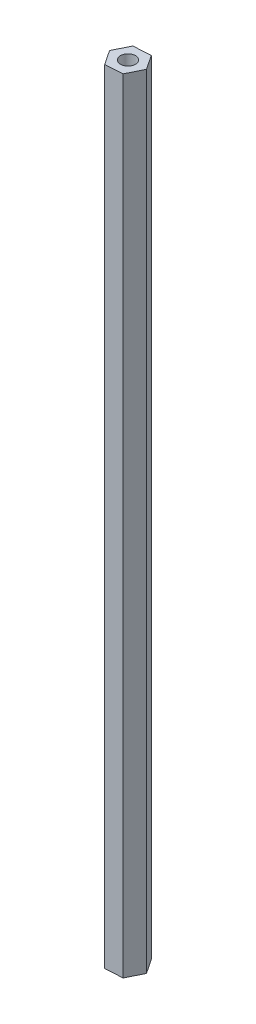
ISO-10303-21;
HEADER;
FILE_DESCRIPTION(('STEP AP214'),'2;1');
FILE_NAME('part.step','',(''),(''),'','','');
FILE_SCHEMA(('AUTOMOTIVE_DESIGN { 1 0 10303 214 1 1 1 1 }'));
ENDSEC;
DATA;
#1=APPLICATION_CONTEXT('core data for automotive mechanical design processes');
#2=APPLICATION_PROTOCOL_DEFINITION('international standard','automotive_design',2000,#1);
#3=PRODUCT_CONTEXT('',#1,'mechanical');
#4=PRODUCT('Part','Part','',(#3));
#5=PRODUCT_RELATED_PRODUCT_CATEGORY('part','',(#4));
#6=PRODUCT_DEFINITION_FORMATION('','',#4);
#7=PRODUCT_DEFINITION_CONTEXT('part definition',#1,'design');
#8=PRODUCT_DEFINITION('design','',#6,#7);
#9=PRODUCT_DEFINITION_SHAPE('','',#8);
#10=(LENGTH_UNIT() NAMED_UNIT(*) SI_UNIT(.MILLI.,.METRE.));
#11=(NAMED_UNIT(*) PLANE_ANGLE_UNIT() SI_UNIT($,.RADIAN.));
#12=(NAMED_UNIT(*) SI_UNIT($,.STERADIAN.) SOLID_ANGLE_UNIT());
#13=UNCERTAINTY_MEASURE_WITH_UNIT(LENGTH_MEASURE(1.E-05),#10,'distance_accuracy_value','');
#14=(GEOMETRIC_REPRESENTATION_CONTEXT(3) GLOBAL_UNCERTAINTY_ASSIGNED_CONTEXT((#13)) GLOBAL_UNIT_ASSIGNED_CONTEXT((#10,
#11,#12)) REPRESENTATION_CONTEXT('',''));
#15=CARTESIAN_POINT('',(0.,0.,0.));
#16=DIRECTION('',(0.,0.,1.));
#17=DIRECTION('',(1.,0.,0.));
#18=AXIS2_PLACEMENT_3D('',#15,#16,#17);
#19=CARTESIAN_POINT('',(0.,156.,0.));
#20=DIRECTION('',(0.,1.,0.));
#21=DIRECTION('',(0.,0.,1.));
#22=AXIS2_PLACEMENT_3D('',#19,#20,#21);
#23=PLANE('',#22);
#24=DIRECTION('',(0.997926790235506,0.,-0.0643593142463476));
#25=VECTOR('',#24,1.);
#26=CARTESIAN_POINT('',(-1.53538196018298,156.,3.10525397292149));
#27=LINE('',#26,#25);
#28=CARTESIAN_POINT('',(-1.53538196018298,156.,3.10525397292149));
#29=VERTEX_POINT('',#28);
#30=CARTESIAN_POINT('',(1.92153784566107,156.,2.88230676849156));
#31=VERTEX_POINT('',#30);
#32=EDGE_CURVE('E131',#29,#31,#27,.T.);
#33=ORIENTED_EDGE('',*,*,#32,.T.);
#34=DIRECTION('',(0.44322659401027,0.,-0.896409608584187));
#35=VECTOR('',#34,1.);
#36=CARTESIAN_POINT('',(1.92153784566107,156.,2.88230676849156));
#37=LINE('',#36,#35);
#38=CARTESIAN_POINT('',(3.45691980584405,156.,-0.222947204429931));
#39=VERTEX_POINT('',#38);
#40=EDGE_CURVE('E89',#31,#39,#37,.T.);
#41=ORIENTED_EDGE('',*,*,#40,.T.);
#42=DIRECTION('',(-0.554700196225236,0.,-0.832050294337839));
#43=VECTOR('',#42,1.);
#44=CARTESIAN_POINT('',(3.45691980584405,156.,-0.222947204429931));
#45=LINE('',#44,#43);
#46=CARTESIAN_POINT('',(1.53538196018298,156.,-3.10525397292149));
#47=VERTEX_POINT('',#46);
#48=EDGE_CURVE('E102',#39,#47,#45,.T.);
#49=ORIENTED_EDGE('',*,*,#48,.T.);
#50=DIRECTION('',(-0.997926790235506,0.,0.0643593142463473));
#51=VECTOR('',#50,1.);
#52=CARTESIAN_POINT('',(1.53538196018298,156.,-3.10525397292149));
#53=LINE('',#52,#51);
#54=CARTESIAN_POINT('',(-1.92153784566107,156.,-2.88230676849156));
#55=VERTEX_POINT('',#54);
#56=EDGE_CURVE('E96',#47,#55,#53,.T.);
#57=ORIENTED_EDGE('',*,*,#56,.T.);
#58=DIRECTION('',(-0.44322659401027,0.,0.896409608584187));
#59=VECTOR('',#58,1.);
#60=CARTESIAN_POINT('',(-1.92153784566107,156.,-2.88230676849156));
#61=LINE('',#60,#59);
#62=CARTESIAN_POINT('',(-3.45691980584405,156.,0.222947204429931));
#63=VERTEX_POINT('',#62);
#64=EDGE_CURVE('E100',#55,#63,#61,.T.);
#65=ORIENTED_EDGE('',*,*,#64,.T.);
#66=DIRECTION('',(0.554700196225236,0.,0.832050294337839));
#67=VECTOR('',#66,1.);
#68=CARTESIAN_POINT('',(-3.45691980584405,156.,0.222947204429931));
#69=LINE('',#68,#67);
#70=EDGE_CURVE('E52',#63,#29,#69,.T.);
#71=ORIENTED_EDGE('',*,*,#70,.T.);
#72=EDGE_LOOP('',(#33,#41,#49,#57,#65,#71));
#73=FACE_BOUND('',#72,.T.);
#74=CARTESIAN_POINT('',(0.,156.,0.));
#75=DIRECTION('',(0.,1.,0.));
#76=DIRECTION('',(0.,0.,1.));
#77=AXIS2_PLACEMENT_3D('',#74,#75,#76);
#78=CIRCLE('',#77,1.5);
#79=CARTESIAN_POINT('',(0.,156.,1.5));
#80=VERTEX_POINT('',#79);
#81=EDGE_CURVE('E124',#80,#80,#78,.T.);
#82=ORIENTED_EDGE('',*,*,#81,.F.);
#83=EDGE_LOOP('',(#82));
#84=FACE_BOUND('',#83,.T.);
#85=ADVANCED_FACE('F35',(#73,#84),#23,.T.);
#86=CARTESIAN_POINT('',(0.,0.,0.));
#87=DIRECTION('',(0.,1.,0.));
#88=DIRECTION('',(0.,0.,1.));
#89=AXIS2_PLACEMENT_3D('',#86,#87,#88);
#90=PLANE('',#89);
#91=DIRECTION('',(0.997926790235506,0.,-0.0643593142463476));
#92=VECTOR('',#91,1.);
#93=CARTESIAN_POINT('',(-1.53538196018298,0.,3.10525397292149));
#94=LINE('',#93,#92);
#95=CARTESIAN_POINT('',(-1.53538196018298,0.,3.10525397292149));
#96=VERTEX_POINT('',#95);
#97=CARTESIAN_POINT('',(1.92153784566107,0.,2.88230676849156));
#98=VERTEX_POINT('',#97);
#99=EDGE_CURVE('E120',#96,#98,#94,.T.);
#100=ORIENTED_EDGE('',*,*,#99,.F.);
#101=DIRECTION('',(0.554700196225236,0.,0.832050294337839));
#102=VECTOR('',#101,1.);
#103=CARTESIAN_POINT('',(-3.45691980584405,0.,0.222947204429931));
#104=LINE('',#103,#102);
#105=CARTESIAN_POINT('',(-3.45691980584405,0.,0.222947204429931));
#106=VERTEX_POINT('',#105);
#107=EDGE_CURVE('E81',#106,#96,#104,.T.);
#108=ORIENTED_EDGE('',*,*,#107,.F.);
#109=DIRECTION('',(-0.44322659401027,0.,0.896409608584187));
#110=VECTOR('',#109,1.);
#111=CARTESIAN_POINT('',(-1.92153784566107,0.,-2.88230676849156));
#112=LINE('',#111,#110);
#113=CARTESIAN_POINT('',(-1.92153784566107,0.,-2.88230676849156));
#114=VERTEX_POINT('',#113);
#115=EDGE_CURVE('E75',#114,#106,#112,.T.);
#116=ORIENTED_EDGE('',*,*,#115,.F.);
#117=DIRECTION('',(-0.997926790235506,0.,0.0643593142463473));
#118=VECTOR('',#117,1.);
#119=CARTESIAN_POINT('',(1.53538196018298,0.,-3.10525397292149));
#120=LINE('',#119,#118);
#121=CARTESIAN_POINT('',(1.53538196018298,0.,-3.10525397292149));
#122=VERTEX_POINT('',#121);
#123=EDGE_CURVE('E110',#122,#114,#120,.T.);
#124=ORIENTED_EDGE('',*,*,#123,.F.);
#125=DIRECTION('',(-0.554700196225236,0.,-0.832050294337839));
#126=VECTOR('',#125,1.);
#127=CARTESIAN_POINT('',(3.45691980584405,0.,-0.222947204429931));
#128=LINE('',#127,#126);
#129=CARTESIAN_POINT('',(3.45691980584405,0.,-0.222947204429931));
#130=VERTEX_POINT('',#129);
#131=EDGE_CURVE('E126',#130,#122,#128,.T.);
#132=ORIENTED_EDGE('',*,*,#131,.F.);
#133=DIRECTION('',(0.44322659401027,0.,-0.896409608584187));
#134=VECTOR('',#133,1.);
#135=CARTESIAN_POINT('',(1.92153784566107,0.,2.88230676849156));
#136=LINE('',#135,#134);
#137=EDGE_CURVE('E123',#98,#130,#136,.T.);
#138=ORIENTED_EDGE('',*,*,#137,.F.);
#139=EDGE_LOOP('',(#100,#108,#116,#124,#132,#138));
#140=FACE_BOUND('',#139,.T.);
#141=CARTESIAN_POINT('',(0.,0.,0.));
#142=DIRECTION('',(0.,1.,0.));
#143=DIRECTION('',(0.,0.,1.));
#144=AXIS2_PLACEMENT_3D('',#141,#142,#143);
#145=CIRCLE('',#144,1.5);
#146=CARTESIAN_POINT('',(0.,0.,1.5));
#147=VERTEX_POINT('',#146);
#148=EDGE_CURVE('E224',#147,#147,#145,.T.);
#149=ORIENTED_EDGE('',*,*,#148,.T.);
#150=EDGE_LOOP('',(#149));
#151=FACE_BOUND('',#150,.T.);
#152=ADVANCED_FACE('F140',(#140,#151),#90,.F.);
#153=CARTESIAN_POINT('',(-1.53538196018298,156.,3.10525397292149));
#154=DIRECTION('',(-0.0643593142463476,0.,-0.997926790235506));
#155=DIRECTION('',(-0.997926790235506,0.,0.0643593142463476));
#156=AXIS2_PLACEMENT_3D('',#153,#154,#155);
#157=PLANE('',#156);
#158=ORIENTED_EDGE('',*,*,#99,.T.);
#159=DIRECTION('',(0.,-1.,0.));
#160=VECTOR('',#159,1.);
#161=CARTESIAN_POINT('',(1.92153784566107,156.,2.88230676849156));
#162=LINE('',#161,#160);
#163=EDGE_CURVE('E11',#31,#98,#162,.T.);
#164=ORIENTED_EDGE('',*,*,#163,.F.);
#165=ORIENTED_EDGE('',*,*,#32,.F.);
#166=DIRECTION('',(0.,-1.,0.));
#167=VECTOR('',#166,1.);
#168=CARTESIAN_POINT('',(-1.53538196018298,156.,3.10525397292149));
#169=LINE('',#168,#167);
#170=EDGE_CURVE('E116',#29,#96,#169,.T.);
#171=ORIENTED_EDGE('',*,*,#170,.T.);
#172=EDGE_LOOP('',(#158,#164,#165,#171));
#173=FACE_BOUND('',#172,.T.);
#174=ADVANCED_FACE('F37',(#173),#157,.F.);
#175=CARTESIAN_POINT('',(1.92153784566107,156.,2.88230676849156));
#176=DIRECTION('',(-0.896409608584187,0.,-0.44322659401027));
#177=DIRECTION('',(-0.44322659401027,0.,0.896409608584187));
#178=AXIS2_PLACEMENT_3D('',#175,#176,#177);
#179=PLANE('',#178);
#180=ORIENTED_EDGE('',*,*,#137,.T.);
#181=DIRECTION('',(0.,-1.,0.));
#182=VECTOR('',#181,1.);
#183=CARTESIAN_POINT('',(3.45691980584405,156.,-0.222947204429931));
#184=LINE('',#183,#182);
#185=EDGE_CURVE('E44',#39,#130,#184,.T.);
#186=ORIENTED_EDGE('',*,*,#185,.F.);
#187=ORIENTED_EDGE('',*,*,#40,.F.);
#188=ORIENTED_EDGE('',*,*,#163,.T.);
#189=EDGE_LOOP('',(#180,#186,#187,#188));
#190=FACE_BOUND('',#189,.T.);
#191=ADVANCED_FACE('F165',(#190),#179,.F.);
#192=CARTESIAN_POINT('',(3.45691980584405,156.,-0.222947204429931));
#193=DIRECTION('',(-0.832050294337839,0.,0.554700196225236));
#194=DIRECTION('',(0.554700196225236,0.,0.832050294337839));
#195=AXIS2_PLACEMENT_3D('',#192,#193,#194);
#196=PLANE('',#195);
#197=ORIENTED_EDGE('',*,*,#131,.T.);
#198=DIRECTION('',(0.,-1.,0.));
#199=VECTOR('',#198,1.);
#200=CARTESIAN_POINT('',(1.53538196018298,156.,-3.10525397292149));
#201=LINE('',#200,#199);
#202=EDGE_CURVE('E111',#47,#122,#201,.T.);
#203=ORIENTED_EDGE('',*,*,#202,.F.);
#204=ORIENTED_EDGE('',*,*,#48,.F.);
#205=ORIENTED_EDGE('',*,*,#185,.T.);
#206=EDGE_LOOP('',(#197,#203,#204,#205));
#207=FACE_BOUND('',#206,.T.);
#208=ADVANCED_FACE('F137',(#207),#196,.F.);
#209=CARTESIAN_POINT('',(1.53538196018298,156.,-3.10525397292149));
#210=DIRECTION('',(0.0643593142463473,0.,0.997926790235506));
#211=DIRECTION('',(0.997926790235506,0.,-0.0643593142463474));
#212=AXIS2_PLACEMENT_3D('',#209,#210,#211);
#213=PLANE('',#212);
#214=ORIENTED_EDGE('',*,*,#123,.T.);
#215=DIRECTION('',(0.,-1.,0.));
#216=VECTOR('',#215,1.);
#217=CARTESIAN_POINT('',(-1.92153784566107,156.,-2.88230676849156));
#218=LINE('',#217,#216);
#219=EDGE_CURVE('E107',#55,#114,#218,.T.);
#220=ORIENTED_EDGE('',*,*,#219,.F.);
#221=ORIENTED_EDGE('',*,*,#56,.F.);
#222=ORIENTED_EDGE('',*,*,#202,.T.);
#223=EDGE_LOOP('',(#214,#220,#221,#222));
#224=FACE_BOUND('',#223,.T.);
#225=ADVANCED_FACE('F108',(#224),#213,.F.);
#226=CARTESIAN_POINT('',(-1.92153784566107,156.,-2.88230676849156));
#227=DIRECTION('',(0.896409608584187,0.,0.44322659401027));
#228=DIRECTION('',(0.44322659401027,0.,-0.896409608584187));
#229=AXIS2_PLACEMENT_3D('',#226,#227,#228);
#230=PLANE('',#229);
#231=ORIENTED_EDGE('',*,*,#115,.T.);
#232=DIRECTION('',(0.,-1.,0.));
#233=VECTOR('',#232,1.);
#234=CARTESIAN_POINT('',(-3.45691980584405,156.,0.222947204429931));
#235=LINE('',#234,#233);
#236=EDGE_CURVE('E112',#63,#106,#235,.T.);
#237=ORIENTED_EDGE('',*,*,#236,.F.);
#238=ORIENTED_EDGE('',*,*,#64,.F.);
#239=ORIENTED_EDGE('',*,*,#219,.T.);
#240=EDGE_LOOP('',(#231,#237,#238,#239));
#241=FACE_BOUND('',#240,.T.);
#242=ADVANCED_FACE('F114',(#241),#230,.F.);
#243=CARTESIAN_POINT('',(-3.45691980584405,156.,0.222947204429931));
#244=DIRECTION('',(0.832050294337839,0.,-0.554700196225236));
#245=DIRECTION('',(-0.554700196225236,0.,-0.832050294337839));
#246=AXIS2_PLACEMENT_3D('',#243,#244,#245);
#247=PLANE('',#246);
#248=ORIENTED_EDGE('',*,*,#107,.T.);
#249=ORIENTED_EDGE('',*,*,#170,.F.);
#250=ORIENTED_EDGE('',*,*,#70,.F.);
#251=ORIENTED_EDGE('',*,*,#236,.T.);
#252=EDGE_LOOP('',(#248,#249,#250,#251));
#253=FACE_BOUND('',#252,.T.);
#254=ADVANCED_FACE('F145',(#253),#247,.F.);
#255=CARTESIAN_POINT('',(0.,156.,0.));
#256=DIRECTION('',(0.,-1.,0.));
#257=DIRECTION('',(0.,0.,-1.));
#258=AXIS2_PLACEMENT_3D('',#255,#256,#257);
#259=CYLINDRICAL_SURFACE('',#258,1.5);
#260=ORIENTED_EDGE('',*,*,#81,.T.);
#261=EDGE_LOOP('',(#260));
#262=FACE_BOUND('',#261,.T.);
#263=ORIENTED_EDGE('',*,*,#148,.F.);
#264=EDGE_LOOP('',(#263));
#265=FACE_BOUND('',#264,.T.);
#266=ADVANCED_FACE('F147',(#262,#265),#259,.F.);
#267=CLOSED_SHELL('',(#85,#152,#174,#191,#208,#225,#242,#254,#266));
#268=MANIFOLD_SOLID_BREP('B2',#267);
#269=ADVANCED_BREP_SHAPE_REPRESENTATION('',(#18,#268),#14);
#270=SHAPE_DEFINITION_REPRESENTATION(#9,#269);
ENDSEC;
END-ISO-10303-21;
